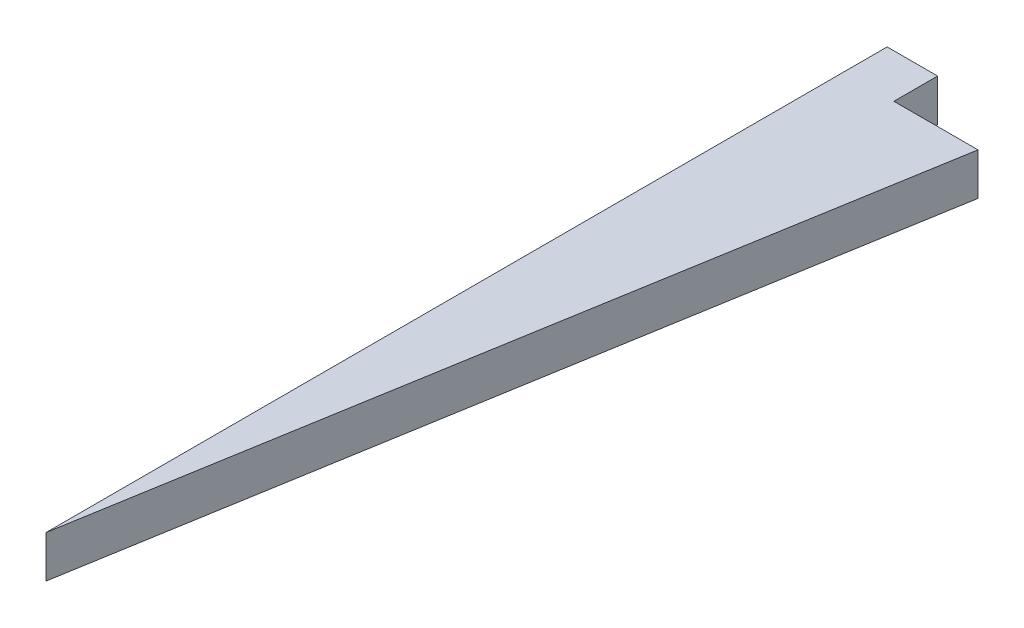
ISO-10303-21;
HEADER;
FILE_DESCRIPTION(('STEP AP214'),'2;1');
FILE_NAME('part.step','',(''),(''),'','','');
FILE_SCHEMA(('AUTOMOTIVE_DESIGN { 1 0 10303 214 1 1 1 1 }'));
ENDSEC;
DATA;
#1=APPLICATION_CONTEXT('core data for automotive mechanical design processes');
#2=APPLICATION_PROTOCOL_DEFINITION('international standard','automotive_design',2000,#1);
#3=PRODUCT_CONTEXT('',#1,'mechanical');
#4=PRODUCT('Part','Part','',(#3));
#5=PRODUCT_RELATED_PRODUCT_CATEGORY('part','',(#4));
#6=PRODUCT_DEFINITION_FORMATION('','',#4);
#7=PRODUCT_DEFINITION_CONTEXT('part definition',#1,'design');
#8=PRODUCT_DEFINITION('design','',#6,#7);
#9=PRODUCT_DEFINITION_SHAPE('','',#8);
#10=(LENGTH_UNIT() NAMED_UNIT(*) SI_UNIT(.MILLI.,.METRE.));
#11=(NAMED_UNIT(*) PLANE_ANGLE_UNIT() SI_UNIT($,.RADIAN.));
#12=(NAMED_UNIT(*) SI_UNIT($,.STERADIAN.) SOLID_ANGLE_UNIT());
#13=UNCERTAINTY_MEASURE_WITH_UNIT(LENGTH_MEASURE(1.E-05),#10,'distance_accuracy_value','');
#14=(GEOMETRIC_REPRESENTATION_CONTEXT(3) GLOBAL_UNCERTAINTY_ASSIGNED_CONTEXT((#13)) GLOBAL_UNIT_ASSIGNED_CONTEXT((#10,
#11,#12)) REPRESENTATION_CONTEXT('',''));
#15=CARTESIAN_POINT('',(0.,0.,0.));
#16=DIRECTION('',(0.,0.,1.));
#17=DIRECTION('',(1.,0.,0.));
#18=AXIS2_PLACEMENT_3D('',#15,#16,#17);
#19=CARTESIAN_POINT('',(0.,0.,0.));
#20=DIRECTION('',(0.,-1.,0.));
#21=DIRECTION('',(0.,0.,-1.));
#22=AXIS2_PLACEMENT_3D('',#19,#20,#21);
#23=PLANE('',#22);
#24=DIRECTION('',(0.,0.,1.));
#25=VECTOR('',#24,1.);
#26=CARTESIAN_POINT('',(-196.463509665884,0.,0.));
#27=LINE('',#26,#25);
#28=CARTESIAN_POINT('',(-196.463509665884,0.,-14.731191202993));
#29=VERTEX_POINT('',#28);
#30=CARTESIAN_POINT('',(-196.463509665884,0.,48.768808797007));
#31=VERTEX_POINT('',#30);
#32=EDGE_CURVE('E165',#29,#31,#27,.T.);
#33=ORIENTED_EDGE('',*,*,#32,.F.);
#34=DIRECTION('',(-1.,0.,0.));
#35=VECTOR('',#34,1.);
#36=CARTESIAN_POINT('',(0.,0.,-14.731191202993));
#37=LINE('',#36,#35);
#38=CARTESIAN_POINT('',(-192.653509665884,0.,-14.731191202993));
#39=VERTEX_POINT('',#38);
#40=EDGE_CURVE('E98',#39,#29,#37,.T.);
#41=ORIENTED_EDGE('',*,*,#40,.F.);
#42=DIRECTION('',(0.,0.,-1.));
#43=VECTOR('',#42,1.);
#44=CARTESIAN_POINT('',(-192.653509665884,0.,0.));
#45=LINE('',#44,#43);
#46=CARTESIAN_POINT('',(-192.653509665884,0.,-11.429191202993));
#47=VERTEX_POINT('',#46);
#48=EDGE_CURVE('E154',#47,#39,#45,.T.);
#49=ORIENTED_EDGE('',*,*,#48,.F.);
#50=DIRECTION('',(-1.,0.,0.));
#51=VECTOR('',#50,1.);
#52=CARTESIAN_POINT('',(0.,0.,-11.429191202993));
#53=LINE('',#52,#51);
#54=CARTESIAN_POINT('',(-186.303509665884,0.,-11.429191202993));
#55=VERTEX_POINT('',#54);
#56=EDGE_CURVE('E179',#55,#47,#53,.T.);
#57=ORIENTED_EDGE('',*,*,#56,.F.);
#58=DIRECTION('',(0.166422701072156,0.,-0.986054503852524));
#59=VECTOR('',#58,1.);
#60=CARTESIAN_POINT('',(-183.019103100753,0.,-30.889300101393));
#61=LINE('',#60,#59);
#62=EDGE_CURVE('E124',#31,#55,#61,.T.);
#63=ORIENTED_EDGE('',*,*,#62,.F.);
#64=EDGE_LOOP('',(#33,#41,#49,#57,#63));
#65=FACE_BOUND('',#64,.T.);
#66=ADVANCED_FACE('F94',(#65),#23,.T.);
#67=CARTESIAN_POINT('',(-192.653509665884,0.,0.));
#68=DIRECTION('',(1.,0.,0.));
#69=DIRECTION('',(0.,0.,-1.));
#70=AXIS2_PLACEMENT_3D('',#67,#68,#69);
#71=PLANE('',#70);
#72=DIRECTION('',(0.,0.,1.));
#73=VECTOR('',#72,1.);
#74=CARTESIAN_POINT('',(-192.653509665884,3.175,0.));
#75=LINE('',#74,#73);
#76=CARTESIAN_POINT('',(-192.653509665884,3.175,-14.731191202993));
#77=VERTEX_POINT('',#76);
#78=CARTESIAN_POINT('',(-192.653509665884,3.175,-11.429191202993));
#79=VERTEX_POINT('',#78);
#80=EDGE_CURVE('E149',#77,#79,#75,.T.);
#81=ORIENTED_EDGE('',*,*,#80,.T.);
#82=DIRECTION('',(0.,1.,0.));
#83=VECTOR('',#82,1.);
#84=CARTESIAN_POINT('',(-192.653509665884,0.,-11.429191202993));
#85=LINE('',#84,#83);
#86=EDGE_CURVE('E151',#47,#79,#85,.T.);
#87=ORIENTED_EDGE('',*,*,#86,.F.);
#88=ORIENTED_EDGE('',*,*,#48,.T.);
#89=DIRECTION('',(0.,1.,0.));
#90=VECTOR('',#89,1.);
#91=CARTESIAN_POINT('',(-192.653509665884,0.,-14.731191202993));
#92=LINE('',#91,#90);
#93=EDGE_CURVE('E156',#39,#77,#92,.T.);
#94=ORIENTED_EDGE('',*,*,#93,.T.);
#95=EDGE_LOOP('',(#81,#87,#88,#94));
#96=FACE_BOUND('',#95,.T.);
#97=ADVANCED_FACE('F155',(#96),#71,.T.);
#98=CARTESIAN_POINT('',(0.,0.,-11.429191202993));
#99=DIRECTION('',(0.,0.,-1.));
#100=DIRECTION('',(-1.,0.,0.));
#101=AXIS2_PLACEMENT_3D('',#98,#99,#100);
#102=PLANE('',#101);
#103=DIRECTION('',(1.,0.,0.));
#104=VECTOR('',#103,1.);
#105=CARTESIAN_POINT('',(0.,3.175,-11.429191202993));
#106=LINE('',#105,#104);
#107=CARTESIAN_POINT('',(-186.303509665884,3.175,-11.429191202993));
#108=VERTEX_POINT('',#107);
#109=EDGE_CURVE('E139',#79,#108,#106,.T.);
#110=ORIENTED_EDGE('',*,*,#109,.T.);
#111=DIRECTION('',(0.,1.,0.));
#112=VECTOR('',#111,1.);
#113=CARTESIAN_POINT('',(-186.303509665884,0.,-11.429191202993));
#114=LINE('',#113,#112);
#115=EDGE_CURVE('E174',#55,#108,#114,.T.);
#116=ORIENTED_EDGE('',*,*,#115,.F.);
#117=ORIENTED_EDGE('',*,*,#56,.T.);
#118=ORIENTED_EDGE('',*,*,#86,.T.);
#119=EDGE_LOOP('',(#110,#116,#117,#118));
#120=FACE_BOUND('',#119,.T.);
#121=ADVANCED_FACE('F187',(#120),#102,.T.);
#122=CARTESIAN_POINT('',(-183.019103100753,0.,-30.889300101393));
#123=DIRECTION('',(0.986054503852524,0.,0.166422701072156));
#124=DIRECTION('',(0.166422701072156,0.,-0.986054503852524));
#125=AXIS2_PLACEMENT_3D('',#122,#123,#124);
#126=PLANE('',#125);
#127=DIRECTION('',(-0.166422701072156,0.,0.986054503852524));
#128=VECTOR('',#127,1.);
#129=CARTESIAN_POINT('',(-183.019103100753,3.175,-30.889300101393));
#130=LINE('',#129,#128);
#131=CARTESIAN_POINT('',(-196.463509665884,3.175,48.768808797007));
#132=VERTEX_POINT('',#131);
#133=EDGE_CURVE('E131',#108,#132,#130,.T.);
#134=ORIENTED_EDGE('',*,*,#133,.T.);
#135=DIRECTION('',(0.,1.,0.));
#136=VECTOR('',#135,1.);
#137=CARTESIAN_POINT('',(-196.463509665884,0.,48.768808797007));
#138=LINE('',#137,#136);
#139=EDGE_CURVE('E166',#31,#132,#138,.T.);
#140=ORIENTED_EDGE('',*,*,#139,.F.);
#141=ORIENTED_EDGE('',*,*,#62,.T.);
#142=ORIENTED_EDGE('',*,*,#115,.T.);
#143=EDGE_LOOP('',(#134,#140,#141,#142));
#144=FACE_BOUND('',#143,.T.);
#145=ADVANCED_FACE('F188',(#144),#126,.T.);
#146=CARTESIAN_POINT('',(-196.463509665884,0.,0.));
#147=DIRECTION('',(-1.,0.,0.));
#148=DIRECTION('',(0.,0.,1.));
#149=AXIS2_PLACEMENT_3D('',#146,#147,#148);
#150=PLANE('',#149);
#151=DIRECTION('',(0.,0.,-1.));
#152=VECTOR('',#151,1.);
#153=CARTESIAN_POINT('',(-196.463509665884,3.175,0.));
#154=LINE('',#153,#152);
#155=CARTESIAN_POINT('',(-196.463509665884,3.175,-14.731191202993));
#156=VERTEX_POINT('',#155);
#157=EDGE_CURVE('E172',#132,#156,#154,.T.);
#158=ORIENTED_EDGE('',*,*,#157,.T.);
#159=DIRECTION('',(0.,1.,0.));
#160=VECTOR('',#159,1.);
#161=CARTESIAN_POINT('',(-196.463509665884,0.,-14.731191202993));
#162=LINE('',#161,#160);
#163=EDGE_CURVE('E12',#29,#156,#162,.T.);
#164=ORIENTED_EDGE('',*,*,#163,.F.);
#165=ORIENTED_EDGE('',*,*,#32,.T.);
#166=ORIENTED_EDGE('',*,*,#139,.T.);
#167=EDGE_LOOP('',(#158,#164,#165,#166));
#168=FACE_BOUND('',#167,.T.);
#169=ADVANCED_FACE('F192',(#168),#150,.T.);
#170=CARTESIAN_POINT('',(0.,0.,-14.731191202993));
#171=DIRECTION('',(0.,0.,-1.));
#172=DIRECTION('',(-1.,0.,0.));
#173=AXIS2_PLACEMENT_3D('',#170,#171,#172);
#174=PLANE('',#173);
#175=DIRECTION('',(1.,0.,0.));
#176=VECTOR('',#175,1.);
#177=CARTESIAN_POINT('',(0.,3.175,-14.731191202993));
#178=LINE('',#177,#176);
#179=EDGE_CURVE('E162',#156,#77,#178,.T.);
#180=ORIENTED_EDGE('',*,*,#179,.T.);
#181=ORIENTED_EDGE('',*,*,#93,.F.);
#182=ORIENTED_EDGE('',*,*,#40,.T.);
#183=ORIENTED_EDGE('',*,*,#163,.T.);
#184=EDGE_LOOP('',(#180,#181,#182,#183));
#185=FACE_BOUND('',#184,.T.);
#186=ADVANCED_FACE('F160',(#185),#174,.T.);
#187=CARTESIAN_POINT('',(0.,3.175,0.));
#188=DIRECTION('',(0.,-1.,0.));
#189=DIRECTION('',(0.,0.,-1.));
#190=AXIS2_PLACEMENT_3D('',#187,#188,#189);
#191=PLANE('',#190);
#192=ORIENTED_EDGE('',*,*,#179,.F.);
#193=ORIENTED_EDGE('',*,*,#157,.F.);
#194=ORIENTED_EDGE('',*,*,#133,.F.);
#195=ORIENTED_EDGE('',*,*,#109,.F.);
#196=ORIENTED_EDGE('',*,*,#80,.F.);
#197=EDGE_LOOP('',(#192,#193,#194,#195,#196));
#198=FACE_BOUND('',#197,.T.);
#199=ADVANCED_FACE('F96',(#198),#191,.F.);
#200=CLOSED_SHELL('',(#66,#97,#121,#145,#169,#186,#199));
#201=MANIFOLD_SOLID_BREP('B2',#200);
#202=ADVANCED_BREP_SHAPE_REPRESENTATION('',(#18,#201),#14);
#203=SHAPE_DEFINITION_REPRESENTATION(#9,#202);
ENDSEC;
END-ISO-10303-21;
